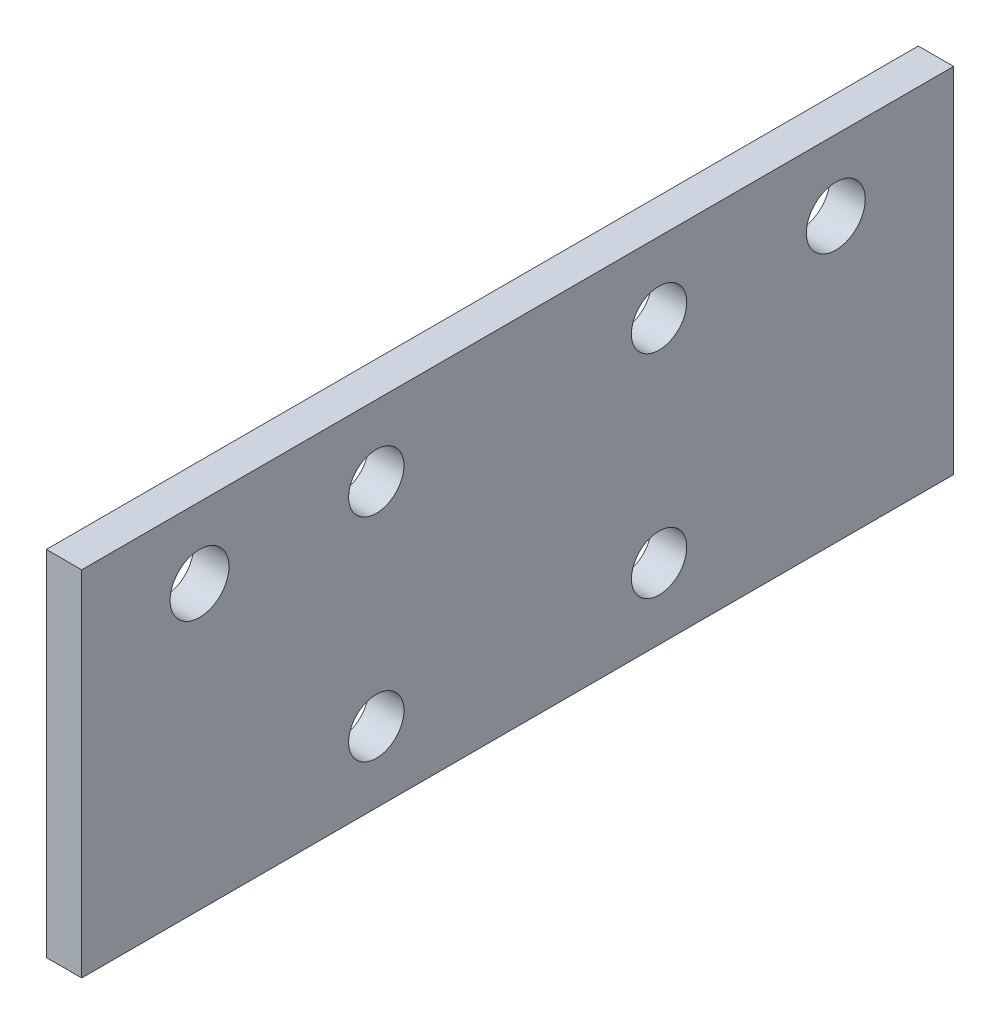
ISO-10303-21;
HEADER;
FILE_DESCRIPTION(('STEP AP214'),'2;1');
FILE_NAME('part.step','',(''),(''),'','','');
FILE_SCHEMA(('AUTOMOTIVE_DESIGN { 1 0 10303 214 1 1 1 1 }'));
ENDSEC;
DATA;
#1=APPLICATION_CONTEXT('core data for automotive mechanical design processes');
#2=APPLICATION_PROTOCOL_DEFINITION('international standard','automotive_design',2000,#1);
#3=PRODUCT_CONTEXT('',#1,'mechanical');
#4=PRODUCT('Part','Part','',(#3));
#5=PRODUCT_RELATED_PRODUCT_CATEGORY('part','',(#4));
#6=PRODUCT_DEFINITION_FORMATION('','',#4);
#7=PRODUCT_DEFINITION_CONTEXT('part definition',#1,'design');
#8=PRODUCT_DEFINITION('design','',#6,#7);
#9=PRODUCT_DEFINITION_SHAPE('','',#8);
#10=(LENGTH_UNIT() NAMED_UNIT(*) SI_UNIT(.MILLI.,.METRE.));
#11=(NAMED_UNIT(*) PLANE_ANGLE_UNIT() SI_UNIT($,.RADIAN.));
#12=(NAMED_UNIT(*) SI_UNIT($,.STERADIAN.) SOLID_ANGLE_UNIT());
#13=UNCERTAINTY_MEASURE_WITH_UNIT(LENGTH_MEASURE(1.E-05),#10,'distance_accuracy_value','');
#14=(GEOMETRIC_REPRESENTATION_CONTEXT(3) GLOBAL_UNCERTAINTY_ASSIGNED_CONTEXT((#13)) GLOBAL_UNIT_ASSIGNED_CONTEXT((#10,
#11,#12)) REPRESENTATION_CONTEXT('',''));
#15=CARTESIAN_POINT('',(0.,0.,0.));
#16=DIRECTION('',(0.,0.,1.));
#17=DIRECTION('',(1.,0.,0.));
#18=AXIS2_PLACEMENT_3D('',#15,#16,#17);
#19=CARTESIAN_POINT('',(3.,0.,-30.433683822173));
#20=DIRECTION('',(0.,0.,1.));
#21=DIRECTION('',(1.,0.,0.));
#22=AXIS2_PLACEMENT_3D('',#19,#20,#21);
#23=PLANE('',#22);
#24=DIRECTION('',(0.,1.,0.));
#25=VECTOR('',#24,1.);
#26=CARTESIAN_POINT('',(0.,0.,-30.433683822173));
#27=LINE('',#26,#25);
#28=CARTESIAN_POINT('',(0.,-17.1887720592756,-30.433683822173));
#29=VERTEX_POINT('',#28);
#30=CARTESIAN_POINT('',(0.,12.8112279407244,-30.433683822173));
#31=VERTEX_POINT('',#30);
#32=EDGE_CURVE('E139',#29,#31,#27,.T.);
#33=ORIENTED_EDGE('',*,*,#32,.T.);
#34=DIRECTION('',(-1.,0.,0.));
#35=VECTOR('',#34,1.);
#36=CARTESIAN_POINT('',(3.,12.8112279407244,-30.433683822173));
#37=LINE('',#36,#35);
#38=CARTESIAN_POINT('',(3.,12.8112279407244,-30.433683822173));
#39=VERTEX_POINT('',#38);
#40=EDGE_CURVE('E11',#39,#31,#37,.T.);
#41=ORIENTED_EDGE('',*,*,#40,.F.);
#42=DIRECTION('',(0.,1.,0.));
#43=VECTOR('',#42,1.);
#44=CARTESIAN_POINT('',(3.,0.,-30.433683822173));
#45=LINE('',#44,#43);
#46=CARTESIAN_POINT('',(3.,-17.1887720592756,-30.433683822173));
#47=VERTEX_POINT('',#46);
#48=EDGE_CURVE('E99',#47,#39,#45,.T.);
#49=ORIENTED_EDGE('',*,*,#48,.F.);
#50=DIRECTION('',(-1.,0.,0.));
#51=VECTOR('',#50,1.);
#52=CARTESIAN_POINT('',(3.,-17.1887720592756,-30.433683822173));
#53=LINE('',#52,#51);
#54=EDGE_CURVE('E134',#47,#29,#53,.T.);
#55=ORIENTED_EDGE('',*,*,#54,.T.);
#56=EDGE_LOOP('',(#33,#41,#49,#55));
#57=FACE_BOUND('',#56,.T.);
#58=ADVANCED_FACE('F45',(#57),#23,.F.);
#59=CARTESIAN_POINT('',(3.,12.8112279407244,0.));
#60=DIRECTION('',(0.,-1.,0.));
#61=DIRECTION('',(0.,0.,-1.));
#62=AXIS2_PLACEMENT_3D('',#59,#60,#61);
#63=PLANE('',#62);
#64=DIRECTION('',(0.,0.,1.));
#65=VECTOR('',#64,1.);
#66=CARTESIAN_POINT('',(0.,12.8112279407244,0.));
#67=LINE('',#66,#65);
#68=CARTESIAN_POINT('',(0.,12.8112279407244,43.566316177827));
#69=VERTEX_POINT('',#68);
#70=EDGE_CURVE('E104',#31,#69,#67,.T.);
#71=ORIENTED_EDGE('',*,*,#70,.T.);
#72=DIRECTION('',(-1.,0.,0.));
#73=VECTOR('',#72,1.);
#74=CARTESIAN_POINT('',(3.,12.8112279407244,43.566316177827));
#75=LINE('',#74,#73);
#76=CARTESIAN_POINT('',(3.,12.8112279407244,43.566316177827));
#77=VERTEX_POINT('',#76);
#78=EDGE_CURVE('E55',#77,#69,#75,.T.);
#79=ORIENTED_EDGE('',*,*,#78,.F.);
#80=DIRECTION('',(0.,0.,1.));
#81=VECTOR('',#80,1.);
#82=CARTESIAN_POINT('',(3.,12.8112279407244,0.));
#83=LINE('',#82,#81);
#84=EDGE_CURVE('E93',#39,#77,#83,.T.);
#85=ORIENTED_EDGE('',*,*,#84,.F.);
#86=ORIENTED_EDGE('',*,*,#40,.T.);
#87=EDGE_LOOP('',(#71,#79,#85,#86));
#88=FACE_BOUND('',#87,.T.);
#89=ADVANCED_FACE('F103',(#88),#63,.F.);
#90=CARTESIAN_POINT('',(3.,0.,43.566316177827));
#91=DIRECTION('',(0.,0.,-1.));
#92=DIRECTION('',(-1.,0.,0.));
#93=AXIS2_PLACEMENT_3D('',#90,#91,#92);
#94=PLANE('',#93);
#95=DIRECTION('',(0.,-1.,0.));
#96=VECTOR('',#95,1.);
#97=CARTESIAN_POINT('',(0.,0.,43.566316177827));
#98=LINE('',#97,#96);
#99=CARTESIAN_POINT('',(0.,-17.1887720592756,43.566316177827));
#100=VERTEX_POINT('',#99);
#101=EDGE_CURVE('E80',#69,#100,#98,.T.);
#102=ORIENTED_EDGE('',*,*,#101,.T.);
#103=DIRECTION('',(-1.,0.,0.));
#104=VECTOR('',#103,1.);
#105=CARTESIAN_POINT('',(3.,-17.1887720592756,43.566316177827));
#106=LINE('',#105,#104);
#107=CARTESIAN_POINT('',(3.,-17.1887720592756,43.566316177827));
#108=VERTEX_POINT('',#107);
#109=EDGE_CURVE('E106',#108,#100,#106,.T.);
#110=ORIENTED_EDGE('',*,*,#109,.F.);
#111=DIRECTION('',(0.,-1.,0.));
#112=VECTOR('',#111,1.);
#113=CARTESIAN_POINT('',(3.,0.,43.566316177827));
#114=LINE('',#113,#112);
#115=EDGE_CURVE('E97',#77,#108,#114,.T.);
#116=ORIENTED_EDGE('',*,*,#115,.F.);
#117=ORIENTED_EDGE('',*,*,#78,.T.);
#118=EDGE_LOOP('',(#102,#110,#116,#117));
#119=FACE_BOUND('',#118,.T.);
#120=ADVANCED_FACE('F107',(#119),#94,.F.);
#121=CARTESIAN_POINT('',(3.,-11.1887720592756,18.566316177827));
#122=DIRECTION('',(-1.,0.,0.));
#123=DIRECTION('',(0.,0.,1.));
#124=AXIS2_PLACEMENT_3D('',#121,#122,#123);
#125=CYLINDRICAL_SURFACE('',#124,2.35);
#126=CARTESIAN_POINT('',(3.,-11.1887720592756,18.566316177827));
#127=DIRECTION('',(1.,0.,0.));
#128=DIRECTION('',(0.,0.,-1.));
#129=AXIS2_PLACEMENT_3D('',#126,#127,#128);
#130=CIRCLE('',#129,2.35);
#131=CARTESIAN_POINT('',(3.,-11.1887720592756,16.216316177827));
#132=VERTEX_POINT('',#131);
#133=EDGE_CURVE('E126',#132,#132,#130,.T.);
#134=ORIENTED_EDGE('',*,*,#133,.T.);
#135=EDGE_LOOP('',(#134));
#136=FACE_BOUND('',#135,.T.);
#137=CARTESIAN_POINT('',(0.,-11.1887720592756,18.566316177827));
#138=DIRECTION('',(1.,0.,0.));
#139=DIRECTION('',(0.,0.,-1.));
#140=AXIS2_PLACEMENT_3D('',#137,#138,#139);
#141=CIRCLE('',#140,2.35);
#142=CARTESIAN_POINT('',(0.,-11.1887720592756,16.216316177827));
#143=VERTEX_POINT('',#142);
#144=EDGE_CURVE('E161',#143,#143,#141,.T.);
#145=ORIENTED_EDGE('',*,*,#144,.F.);
#146=EDGE_LOOP('',(#145));
#147=FACE_BOUND('',#146,.T.);
#148=ADVANCED_FACE('F206',(#136,#147),#125,.F.);
#149=CARTESIAN_POINT('',(3.,-11.1887720592756,-5.433683822173));
#150=DIRECTION('',(-1.,0.,0.));
#151=DIRECTION('',(0.,0.,1.));
#152=AXIS2_PLACEMENT_3D('',#149,#150,#151);
#153=CYLINDRICAL_SURFACE('',#152,2.35);
#154=CARTESIAN_POINT('',(3.,-11.1887720592756,-5.433683822173));
#155=DIRECTION('',(1.,0.,0.));
#156=DIRECTION('',(0.,0.,-1.));
#157=AXIS2_PLACEMENT_3D('',#154,#155,#156);
#158=CIRCLE('',#157,2.35);
#159=CARTESIAN_POINT('',(3.,-11.1887720592756,-7.78368382217301));
#160=VERTEX_POINT('',#159);
#161=EDGE_CURVE('E122',#160,#160,#158,.T.);
#162=ORIENTED_EDGE('',*,*,#161,.T.);
#163=EDGE_LOOP('',(#162));
#164=FACE_BOUND('',#163,.T.);
#165=CARTESIAN_POINT('',(0.,-11.1887720592756,-5.433683822173));
#166=DIRECTION('',(1.,0.,0.));
#167=DIRECTION('',(0.,0.,-1.));
#168=AXIS2_PLACEMENT_3D('',#165,#166,#167);
#169=CIRCLE('',#168,2.35);
#170=CARTESIAN_POINT('',(0.,-11.1887720592756,-7.78368382217301));
#171=VERTEX_POINT('',#170);
#172=EDGE_CURVE('E157',#171,#171,#169,.T.);
#173=ORIENTED_EDGE('',*,*,#172,.F.);
#174=EDGE_LOOP('',(#173));
#175=FACE_BOUND('',#174,.T.);
#176=ADVANCED_FACE('F216',(#164,#175),#153,.F.);
#177=CARTESIAN_POINT('',(3.,6.81122794072436,-5.433683822173));
#178=DIRECTION('',(-1.,0.,0.));
#179=DIRECTION('',(0.,0.,1.));
#180=AXIS2_PLACEMENT_3D('',#177,#178,#179);
#181=CYLINDRICAL_SURFACE('',#180,2.35);
#182=CARTESIAN_POINT('',(3.,6.81122794072436,-5.433683822173));
#183=DIRECTION('',(1.,0.,0.));
#184=DIRECTION('',(0.,0.,-1.));
#185=AXIS2_PLACEMENT_3D('',#182,#183,#184);
#186=CIRCLE('',#185,2.35);
#187=CARTESIAN_POINT('',(3.,6.81122794072436,-7.78368382217301));
#188=VERTEX_POINT('',#187);
#189=EDGE_CURVE('E118',#188,#188,#186,.T.);
#190=ORIENTED_EDGE('',*,*,#189,.T.);
#191=EDGE_LOOP('',(#190));
#192=FACE_BOUND('',#191,.T.);
#193=CARTESIAN_POINT('',(0.,6.81122794072436,-5.433683822173));
#194=DIRECTION('',(1.,0.,0.));
#195=DIRECTION('',(0.,0.,-1.));
#196=AXIS2_PLACEMENT_3D('',#193,#194,#195);
#197=CIRCLE('',#196,2.35);
#198=CARTESIAN_POINT('',(0.,6.81122794072436,-7.78368382217301));
#199=VERTEX_POINT('',#198);
#200=EDGE_CURVE('E153',#199,#199,#197,.T.);
#201=ORIENTED_EDGE('',*,*,#200,.F.);
#202=EDGE_LOOP('',(#201));
#203=FACE_BOUND('',#202,.T.);
#204=ADVANCED_FACE('F212',(#192,#203),#181,.F.);
#205=CARTESIAN_POINT('',(3.,6.81122794072436,18.566316177827));
#206=DIRECTION('',(-1.,0.,0.));
#207=DIRECTION('',(0.,0.,1.));
#208=AXIS2_PLACEMENT_3D('',#205,#206,#207);
#209=CYLINDRICAL_SURFACE('',#208,2.35000000000001);
#210=CARTESIAN_POINT('',(3.,6.81122794072436,18.566316177827));
#211=DIRECTION('',(1.,0.,0.));
#212=DIRECTION('',(0.,0.,-1.));
#213=AXIS2_PLACEMENT_3D('',#210,#211,#212);
#214=CIRCLE('',#213,2.35000000000001);
#215=CARTESIAN_POINT('',(3.,6.81122794072436,16.216316177827));
#216=VERTEX_POINT('',#215);
#217=EDGE_CURVE('E111',#216,#216,#214,.T.);
#218=ORIENTED_EDGE('',*,*,#217,.T.);
#219=EDGE_LOOP('',(#218));
#220=FACE_BOUND('',#219,.T.);
#221=CARTESIAN_POINT('',(0.,6.81122794072436,18.566316177827));
#222=DIRECTION('',(1.,0.,0.));
#223=DIRECTION('',(0.,0.,-1.));
#224=AXIS2_PLACEMENT_3D('',#221,#222,#223);
#225=CIRCLE('',#224,2.35000000000001);
#226=CARTESIAN_POINT('',(0.,6.81122794072436,16.216316177827));
#227=VERTEX_POINT('',#226);
#228=EDGE_CURVE('E149',#227,#227,#225,.T.);
#229=ORIENTED_EDGE('',*,*,#228,.F.);
#230=EDGE_LOOP('',(#229));
#231=FACE_BOUND('',#230,.T.);
#232=ADVANCED_FACE('F209',(#220,#231),#209,.F.);
#233=CARTESIAN_POINT('',(3.,-17.1887720592756,0.));
#234=DIRECTION('',(0.,1.,0.));
#235=DIRECTION('',(0.,0.,1.));
#236=AXIS2_PLACEMENT_3D('',#233,#234,#235);
#237=PLANE('',#236);
#238=DIRECTION('',(0.,0.,-1.));
#239=VECTOR('',#238,1.);
#240=CARTESIAN_POINT('',(0.,-17.1887720592756,0.));
#241=LINE('',#240,#239);
#242=EDGE_CURVE('E86',#100,#29,#241,.T.);
#243=ORIENTED_EDGE('',*,*,#242,.T.);
#244=ORIENTED_EDGE('',*,*,#54,.F.);
#245=DIRECTION('',(0.,0.,-1.));
#246=VECTOR('',#245,1.);
#247=CARTESIAN_POINT('',(3.,-17.1887720592756,0.));
#248=LINE('',#247,#246);
#249=EDGE_CURVE('E63',#108,#47,#248,.T.);
#250=ORIENTED_EDGE('',*,*,#249,.F.);
#251=ORIENTED_EDGE('',*,*,#109,.T.);
#252=EDGE_LOOP('',(#243,#244,#250,#251));
#253=FACE_BOUND('',#252,.T.);
#254=ADVANCED_FACE('F173',(#253),#237,.F.);
#255=CARTESIAN_POINT('',(3.,6.81122794072436,-20.433683822173));
#256=DIRECTION('',(-1.,0.,0.));
#257=DIRECTION('',(0.,0.,1.));
#258=AXIS2_PLACEMENT_3D('',#255,#256,#257);
#259=CYLINDRICAL_SURFACE('',#258,2.5);
#260=CARTESIAN_POINT('',(3.,6.81122794072436,-20.433683822173));
#261=DIRECTION('',(1.,0.,0.));
#262=DIRECTION('',(0.,0.,-1.));
#263=AXIS2_PLACEMENT_3D('',#260,#261,#262);
#264=CIRCLE('',#263,2.5);
#265=CARTESIAN_POINT('',(3.,6.81122794072436,-22.933683822173));
#266=VERTEX_POINT('',#265);
#267=EDGE_CURVE('E169',#266,#266,#264,.T.);
#268=ORIENTED_EDGE('',*,*,#267,.T.);
#269=EDGE_LOOP('',(#268));
#270=FACE_BOUND('',#269,.T.);
#271=CARTESIAN_POINT('',(0.,6.81122794072436,-20.433683822173));
#272=DIRECTION('',(1.,0.,0.));
#273=DIRECTION('',(0.,0.,-1.));
#274=AXIS2_PLACEMENT_3D('',#271,#272,#273);
#275=CIRCLE('',#274,2.5);
#276=CARTESIAN_POINT('',(0.,6.81122794072436,-22.933683822173));
#277=VERTEX_POINT('',#276);
#278=EDGE_CURVE('E135',#277,#277,#275,.T.);
#279=ORIENTED_EDGE('',*,*,#278,.F.);
#280=EDGE_LOOP('',(#279));
#281=FACE_BOUND('',#280,.T.);
#282=ADVANCED_FACE('F47',(#270,#281),#259,.F.);
#283=CARTESIAN_POINT('',(3.,6.81122794072436,33.566316177827));
#284=DIRECTION('',(-1.,0.,0.));
#285=DIRECTION('',(0.,0.,1.));
#286=AXIS2_PLACEMENT_3D('',#283,#284,#285);
#287=CYLINDRICAL_SURFACE('',#286,2.5);
#288=CARTESIAN_POINT('',(3.,6.81122794072436,33.566316177827));
#289=DIRECTION('',(1.,0.,0.));
#290=DIRECTION('',(0.,0.,-1.));
#291=AXIS2_PLACEMENT_3D('',#288,#289,#290);
#292=CIRCLE('',#291,2.5);
#293=CARTESIAN_POINT('',(3.,6.81122794072436,31.066316177827));
#294=VERTEX_POINT('',#293);
#295=EDGE_CURVE('E130',#294,#294,#292,.T.);
#296=ORIENTED_EDGE('',*,*,#295,.T.);
#297=EDGE_LOOP('',(#296));
#298=FACE_BOUND('',#297,.T.);
#299=CARTESIAN_POINT('',(0.,6.81122794072436,33.566316177827));
#300=DIRECTION('',(1.,0.,0.));
#301=DIRECTION('',(0.,0.,-1.));
#302=AXIS2_PLACEMENT_3D('',#299,#300,#301);
#303=CIRCLE('',#302,2.5);
#304=CARTESIAN_POINT('',(0.,6.81122794072436,31.066316177827));
#305=VERTEX_POINT('',#304);
#306=EDGE_CURVE('E165',#305,#305,#303,.T.);
#307=ORIENTED_EDGE('',*,*,#306,.F.);
#308=EDGE_LOOP('',(#307));
#309=FACE_BOUND('',#308,.T.);
#310=ADVANCED_FACE('F188',(#298,#309),#287,.F.);
#311=CARTESIAN_POINT('',(3.,0.,0.));
#312=DIRECTION('',(1.,0.,0.));
#313=DIRECTION('',(0.,0.,-1.));
#314=AXIS2_PLACEMENT_3D('',#311,#312,#313);
#315=PLANE('',#314);
#316=ORIENTED_EDGE('',*,*,#267,.F.);
#317=EDGE_LOOP('',(#316));
#318=FACE_BOUND('',#317,.T.);
#319=ORIENTED_EDGE('',*,*,#48,.T.);
#320=ORIENTED_EDGE('',*,*,#84,.T.);
#321=ORIENTED_EDGE('',*,*,#115,.T.);
#322=ORIENTED_EDGE('',*,*,#249,.T.);
#323=EDGE_LOOP('',(#319,#320,#321,#322));
#324=FACE_BOUND('',#323,.T.);
#325=ORIENTED_EDGE('',*,*,#217,.F.);
#326=EDGE_LOOP('',(#325));
#327=FACE_BOUND('',#326,.T.);
#328=ORIENTED_EDGE('',*,*,#189,.F.);
#329=EDGE_LOOP('',(#328));
#330=FACE_BOUND('',#329,.T.);
#331=ORIENTED_EDGE('',*,*,#161,.F.);
#332=EDGE_LOOP('',(#331));
#333=FACE_BOUND('',#332,.T.);
#334=ORIENTED_EDGE('',*,*,#133,.F.);
#335=EDGE_LOOP('',(#334));
#336=FACE_BOUND('',#335,.T.);
#337=ORIENTED_EDGE('',*,*,#295,.F.);
#338=EDGE_LOOP('',(#337));
#339=FACE_BOUND('',#338,.T.);
#340=ADVANCED_FACE('F94',(#318,#324,#327,#330,#333,#336,#339),#315,.T.);
#341=CARTESIAN_POINT('',(0.,0.,0.));
#342=DIRECTION('',(1.,0.,0.));
#343=DIRECTION('',(0.,0.,-1.));
#344=AXIS2_PLACEMENT_3D('',#341,#342,#343);
#345=PLANE('',#344);
#346=ORIENTED_EDGE('',*,*,#278,.T.);
#347=EDGE_LOOP('',(#346));
#348=FACE_BOUND('',#347,.T.);
#349=ORIENTED_EDGE('',*,*,#32,.F.);
#350=ORIENTED_EDGE('',*,*,#242,.F.);
#351=ORIENTED_EDGE('',*,*,#101,.F.);
#352=ORIENTED_EDGE('',*,*,#70,.F.);
#353=EDGE_LOOP('',(#349,#350,#351,#352));
#354=FACE_BOUND('',#353,.T.);
#355=ORIENTED_EDGE('',*,*,#228,.T.);
#356=EDGE_LOOP('',(#355));
#357=FACE_BOUND('',#356,.T.);
#358=ORIENTED_EDGE('',*,*,#200,.T.);
#359=EDGE_LOOP('',(#358));
#360=FACE_BOUND('',#359,.T.);
#361=ORIENTED_EDGE('',*,*,#172,.T.);
#362=EDGE_LOOP('',(#361));
#363=FACE_BOUND('',#362,.T.);
#364=ORIENTED_EDGE('',*,*,#144,.T.);
#365=EDGE_LOOP('',(#364));
#366=FACE_BOUND('',#365,.T.);
#367=ORIENTED_EDGE('',*,*,#306,.T.);
#368=EDGE_LOOP('',(#367));
#369=FACE_BOUND('',#368,.T.);
#370=ADVANCED_FACE('F176',(#348,#354,#357,#360,#363,#366,#369),#345,.F.);
#371=CLOSED_SHELL('',(#58,#89,#120,#148,#176,#204,#232,#254,#282,#310,#340,#370));
#372=MANIFOLD_SOLID_BREP('B2',#371);
#373=ADVANCED_BREP_SHAPE_REPRESENTATION('',(#18,#372),#14);
#374=SHAPE_DEFINITION_REPRESENTATION(#9,#373);
ENDSEC;
END-ISO-10303-21;
